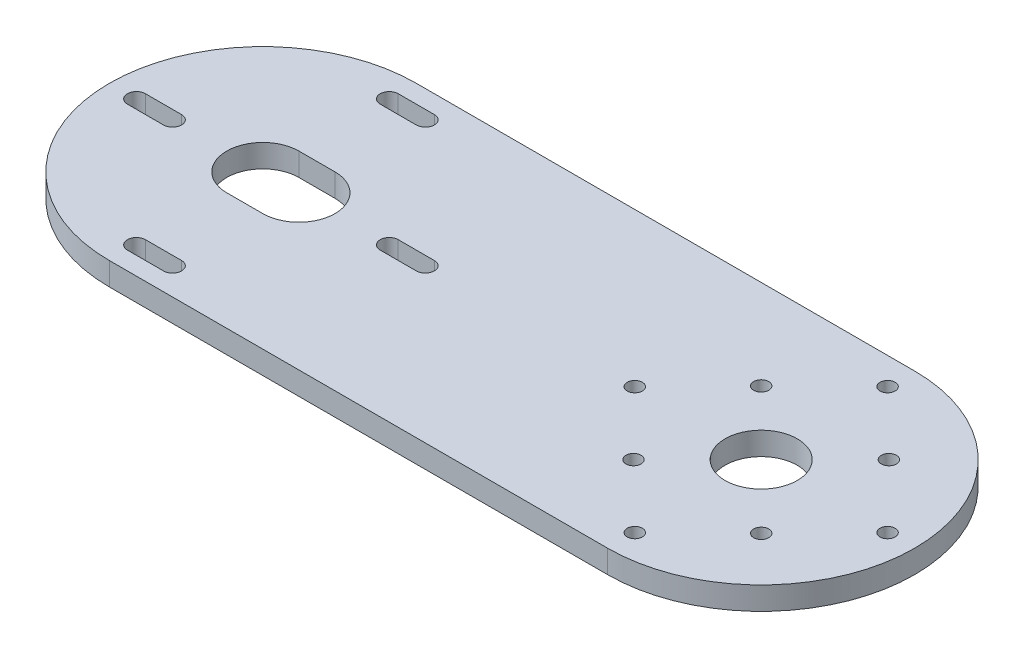
ISO-10303-21;
HEADER;
FILE_DESCRIPTION(('STEP AP214'),'2;1');
FILE_NAME('part.step','',(''),(''),'','','');
FILE_SCHEMA(('AUTOMOTIVE_DESIGN { 1 0 10303 214 1 1 1 1 }'));
ENDSEC;
DATA;
#1=APPLICATION_CONTEXT('core data for automotive mechanical design processes');
#2=APPLICATION_PROTOCOL_DEFINITION('international standard','automotive_design',2000,#1);
#3=PRODUCT_CONTEXT('',#1,'mechanical');
#4=PRODUCT('Part','Part','',(#3));
#5=PRODUCT_RELATED_PRODUCT_CATEGORY('part','',(#4));
#6=PRODUCT_DEFINITION_FORMATION('','',#4);
#7=PRODUCT_DEFINITION_CONTEXT('part definition',#1,'design');
#8=PRODUCT_DEFINITION('design','',#6,#7);
#9=PRODUCT_DEFINITION_SHAPE('','',#8);
#10=(LENGTH_UNIT() NAMED_UNIT(*) SI_UNIT(.MILLI.,.METRE.));
#11=(NAMED_UNIT(*) PLANE_ANGLE_UNIT() SI_UNIT($,.RADIAN.));
#12=(NAMED_UNIT(*) SI_UNIT($,.STERADIAN.) SOLID_ANGLE_UNIT());
#13=UNCERTAINTY_MEASURE_WITH_UNIT(LENGTH_MEASURE(1.E-05),#10,'distance_accuracy_value','');
#14=(GEOMETRIC_REPRESENTATION_CONTEXT(3) GLOBAL_UNCERTAINTY_ASSIGNED_CONTEXT((#13)) GLOBAL_UNIT_ASSIGNED_CONTEXT((#10,
#11,#12)) REPRESENTATION_CONTEXT('',''));
#15=CARTESIAN_POINT('',(0.,0.,0.));
#16=DIRECTION('',(0.,0.,1.));
#17=DIRECTION('',(1.,0.,0.));
#18=AXIS2_PLACEMENT_3D('',#15,#16,#17);
#19=CARTESIAN_POINT('',(-128.,-6.35,-35.));
#20=DIRECTION('',(0.,1.,0.));
#21=DIRECTION('',(0.,0.,1.));
#22=AXIS2_PLACEMENT_3D('',#19,#20,#21);
#23=CYLINDRICAL_SURFACE('',#22,2.5);
#24=CARTESIAN_POINT('',(-128.,0.,-35.));
#25=DIRECTION('',(0.,1.,0.));
#26=DIRECTION('',(0.,0.,1.));
#27=AXIS2_PLACEMENT_3D('',#24,#25,#26);
#28=CIRCLE('',#27,2.5);
#29=CARTESIAN_POINT('',(-128.,0.,-32.5));
#30=VERTEX_POINT('',#29);
#31=CARTESIAN_POINT('',(-128.,0.,-37.5));
#32=VERTEX_POINT('',#31);
#33=EDGE_CURVE('E309',#30,#32,#28,.T.);
#34=ORIENTED_EDGE('',*,*,#33,.T.);
#35=DIRECTION('',(0.,1.,0.));
#36=VECTOR('',#35,1.);
#37=CARTESIAN_POINT('',(-128.,-6.35,-37.5));
#38=LINE('',#37,#36);
#39=CARTESIAN_POINT('',(-128.,-6.35,-37.5));
#40=VERTEX_POINT('',#39);
#41=EDGE_CURVE('E11',#40,#32,#38,.T.);
#42=ORIENTED_EDGE('',*,*,#41,.F.);
#43=CARTESIAN_POINT('',(-128.,-6.35,-35.));
#44=DIRECTION('',(0.,1.,0.));
#45=DIRECTION('',(0.,0.,1.));
#46=AXIS2_PLACEMENT_3D('',#43,#44,#45);
#47=CIRCLE('',#46,2.5);
#48=CARTESIAN_POINT('',(-128.,-6.35,-32.5));
#49=VERTEX_POINT('',#48);
#50=EDGE_CURVE('E54',#49,#40,#47,.T.);
#51=ORIENTED_EDGE('',*,*,#50,.F.);
#52=DIRECTION('',(0.,1.,0.));
#53=VECTOR('',#52,1.);
#54=CARTESIAN_POINT('',(-128.,-6.35,-32.5));
#55=LINE('',#54,#53);
#56=EDGE_CURVE('E219',#49,#30,#55,.T.);
#57=ORIENTED_EDGE('',*,*,#56,.T.);
#58=EDGE_LOOP('',(#34,#42,#51,#57));
#59=FACE_BOUND('',#58,.T.);
#60=ADVANCED_FACE('F35',(#59),#23,.F.);
#61=CARTESIAN_POINT('',(0.,-6.35,-37.4999999999999));
#62=DIRECTION('',(0.,0.,1.));
#63=DIRECTION('',(1.,0.,0.));
#64=AXIS2_PLACEMENT_3D('',#61,#62,#63);
#65=PLANE('',#64);
#66=DIRECTION('',(1.,0.,0.));
#67=VECTOR('',#66,1.);
#68=CARTESIAN_POINT('',(0.,0.,-37.4999999999999));
#69=LINE('',#68,#67);
#70=CARTESIAN_POINT('',(-138.,0.,-37.5));
#71=VERTEX_POINT('',#70);
#72=EDGE_CURVE('E314',#71,#32,#69,.T.);
#73=ORIENTED_EDGE('',*,*,#72,.F.);
#74=DIRECTION('',(0.,1.,0.));
#75=VECTOR('',#74,1.);
#76=CARTESIAN_POINT('',(-138.,-6.35,-37.5));
#77=LINE('',#76,#75);
#78=CARTESIAN_POINT('',(-138.,-6.35,-37.5));
#79=VERTEX_POINT('',#78);
#80=EDGE_CURVE('E45',#79,#71,#77,.T.);
#81=ORIENTED_EDGE('',*,*,#80,.F.);
#82=DIRECTION('',(1.,0.,0.));
#83=VECTOR('',#82,1.);
#84=CARTESIAN_POINT('',(0.,-6.35,-37.4999999999999));
#85=LINE('',#84,#83);
#86=EDGE_CURVE('E211',#79,#40,#85,.T.);
#87=ORIENTED_EDGE('',*,*,#86,.T.);
#88=ORIENTED_EDGE('',*,*,#41,.T.);
#89=EDGE_LOOP('',(#73,#81,#87,#88));
#90=FACE_BOUND('',#89,.T.);
#91=ADVANCED_FACE('F485',(#90),#65,.T.);
#92=CARTESIAN_POINT('',(-138.,-6.35,-35.));
#93=DIRECTION('',(0.,1.,0.));
#94=DIRECTION('',(0.,0.,1.));
#95=AXIS2_PLACEMENT_3D('',#92,#93,#94);
#96=CYLINDRICAL_SURFACE('',#95,2.50000000000001);
#97=CARTESIAN_POINT('',(-138.,0.,-35.));
#98=DIRECTION('',(0.,1.,0.));
#99=DIRECTION('',(0.,0.,1.));
#100=AXIS2_PLACEMENT_3D('',#97,#98,#99);
#101=CIRCLE('',#100,2.50000000000001);
#102=CARTESIAN_POINT('',(-138.,0.,-32.5));
#103=VERTEX_POINT('',#102);
#104=EDGE_CURVE('E216',#71,#103,#101,.T.);
#105=ORIENTED_EDGE('',*,*,#104,.T.);
#106=DIRECTION('',(0.,1.,0.));
#107=VECTOR('',#106,1.);
#108=CARTESIAN_POINT('',(-138.,-6.35,-32.5));
#109=LINE('',#108,#107);
#110=CARTESIAN_POINT('',(-138.,-6.35,-32.5));
#111=VERTEX_POINT('',#110);
#112=EDGE_CURVE('E214',#111,#103,#109,.T.);
#113=ORIENTED_EDGE('',*,*,#112,.F.);
#114=CARTESIAN_POINT('',(-138.,-6.35,-35.));
#115=DIRECTION('',(0.,1.,0.));
#116=DIRECTION('',(0.,0.,1.));
#117=AXIS2_PLACEMENT_3D('',#114,#115,#116);
#118=CIRCLE('',#117,2.50000000000001);
#119=EDGE_CURVE('E204',#79,#111,#118,.T.);
#120=ORIENTED_EDGE('',*,*,#119,.F.);
#121=ORIENTED_EDGE('',*,*,#80,.T.);
#122=EDGE_LOOP('',(#105,#113,#120,#121));
#123=FACE_BOUND('',#122,.T.);
#124=ADVANCED_FACE('F215',(#123),#96,.F.);
#125=CARTESIAN_POINT('',(-163.,-6.35,0.));
#126=DIRECTION('',(0.,1.,0.));
#127=DIRECTION('',(0.,0.,1.));
#128=AXIS2_PLACEMENT_3D('',#125,#126,#127);
#129=CYLINDRICAL_SURFACE('',#128,2.5);
#130=CARTESIAN_POINT('',(-163.,0.,0.));
#131=DIRECTION('',(0.,1.,0.));
#132=DIRECTION('',(0.,0.,1.));
#133=AXIS2_PLACEMENT_3D('',#130,#131,#132);
#134=CIRCLE('',#133,2.5);
#135=CARTESIAN_POINT('',(-163.,0.,2.5));
#136=VERTEX_POINT('',#135);
#137=CARTESIAN_POINT('',(-163.,0.,-2.5));
#138=VERTEX_POINT('',#137);
#139=EDGE_CURVE('E299',#136,#138,#134,.T.);
#140=ORIENTED_EDGE('',*,*,#139,.T.);
#141=DIRECTION('',(0.,1.,0.));
#142=VECTOR('',#141,1.);
#143=CARTESIAN_POINT('',(-163.,-6.35,-2.5));
#144=LINE('',#143,#142);
#145=CARTESIAN_POINT('',(-163.,-6.35,-2.5));
#146=VERTEX_POINT('',#145);
#147=EDGE_CURVE('E347',#146,#138,#144,.T.);
#148=ORIENTED_EDGE('',*,*,#147,.F.);
#149=CARTESIAN_POINT('',(-163.,-6.35,0.));
#150=DIRECTION('',(0.,1.,0.));
#151=DIRECTION('',(0.,0.,1.));
#152=AXIS2_PLACEMENT_3D('',#149,#150,#151);
#153=CIRCLE('',#152,2.5);
#154=CARTESIAN_POINT('',(-163.,-6.35,2.5));
#155=VERTEX_POINT('',#154);
#156=EDGE_CURVE('E442',#155,#146,#153,.T.);
#157=ORIENTED_EDGE('',*,*,#156,.F.);
#158=DIRECTION('',(0.,1.,0.));
#159=VECTOR('',#158,1.);
#160=CARTESIAN_POINT('',(-163.,-6.35,2.5));
#161=LINE('',#160,#159);
#162=EDGE_CURVE('E354',#155,#136,#161,.T.);
#163=ORIENTED_EDGE('',*,*,#162,.T.);
#164=EDGE_LOOP('',(#140,#148,#157,#163));
#165=FACE_BOUND('',#164,.T.);
#166=ADVANCED_FACE('F460',(#165),#129,.F.);
#167=CARTESIAN_POINT('',(0.,-6.35,-2.5));
#168=DIRECTION('',(0.,0.,1.));
#169=DIRECTION('',(1.,0.,0.));
#170=AXIS2_PLACEMENT_3D('',#167,#168,#169);
#171=PLANE('',#170);
#172=DIRECTION('',(1.,0.,0.));
#173=VECTOR('',#172,1.);
#174=CARTESIAN_POINT('',(0.,0.,-2.5));
#175=LINE('',#174,#173);
#176=CARTESIAN_POINT('',(-173.,0.,-2.5));
#177=VERTEX_POINT('',#176);
#178=EDGE_CURVE('E306',#177,#138,#175,.T.);
#179=ORIENTED_EDGE('',*,*,#178,.F.);
#180=DIRECTION('',(0.,1.,0.));
#181=VECTOR('',#180,1.);
#182=CARTESIAN_POINT('',(-173.,-6.35,-2.5));
#183=LINE('',#182,#181);
#184=CARTESIAN_POINT('',(-173.,-6.35,-2.5));
#185=VERTEX_POINT('',#184);
#186=EDGE_CURVE('E349',#185,#177,#183,.T.);
#187=ORIENTED_EDGE('',*,*,#186,.F.);
#188=DIRECTION('',(1.,0.,0.));
#189=VECTOR('',#188,1.);
#190=CARTESIAN_POINT('',(0.,-6.35,-2.5));
#191=LINE('',#190,#189);
#192=EDGE_CURVE('E224',#185,#146,#191,.T.);
#193=ORIENTED_EDGE('',*,*,#192,.T.);
#194=ORIENTED_EDGE('',*,*,#147,.T.);
#195=EDGE_LOOP('',(#179,#187,#193,#194));
#196=FACE_BOUND('',#195,.T.);
#197=ADVANCED_FACE('F451',(#196),#171,.T.);
#198=CARTESIAN_POINT('',(-173.,-6.35,0.));
#199=DIRECTION('',(0.,1.,0.));
#200=DIRECTION('',(0.,0.,1.));
#201=AXIS2_PLACEMENT_3D('',#198,#199,#200);
#202=CYLINDRICAL_SURFACE('',#201,2.5);
#203=CARTESIAN_POINT('',(-173.,0.,0.));
#204=DIRECTION('',(0.,1.,0.));
#205=DIRECTION('',(0.,0.,1.));
#206=AXIS2_PLACEMENT_3D('',#203,#204,#205);
#207=CIRCLE('',#206,2.5);
#208=CARTESIAN_POINT('',(-173.,0.,2.5));
#209=VERTEX_POINT('',#208);
#210=EDGE_CURVE('E304',#177,#209,#207,.T.);
#211=ORIENTED_EDGE('',*,*,#210,.T.);
#212=DIRECTION('',(0.,1.,0.));
#213=VECTOR('',#212,1.);
#214=CARTESIAN_POINT('',(-173.,-6.35,2.5));
#215=LINE('',#214,#213);
#216=CARTESIAN_POINT('',(-173.,-6.35,2.5));
#217=VERTEX_POINT('',#216);
#218=EDGE_CURVE('E351',#217,#209,#215,.T.);
#219=ORIENTED_EDGE('',*,*,#218,.F.);
#220=CARTESIAN_POINT('',(-173.,-6.35,0.));
#221=DIRECTION('',(0.,1.,0.));
#222=DIRECTION('',(0.,0.,1.));
#223=AXIS2_PLACEMENT_3D('',#220,#221,#222);
#224=CIRCLE('',#223,2.5);
#225=EDGE_CURVE('E446',#185,#217,#224,.T.);
#226=ORIENTED_EDGE('',*,*,#225,.F.);
#227=ORIENTED_EDGE('',*,*,#186,.T.);
#228=EDGE_LOOP('',(#211,#219,#226,#227));
#229=FACE_BOUND('',#228,.T.);
#230=ADVANCED_FACE('F467',(#229),#202,.F.);
#231=CARTESIAN_POINT('',(-128.,-6.35,35.));
#232=DIRECTION('',(0.,1.,0.));
#233=DIRECTION('',(0.,0.,1.));
#234=AXIS2_PLACEMENT_3D('',#231,#232,#233);
#235=CYLINDRICAL_SURFACE('',#234,2.5);
#236=CARTESIAN_POINT('',(-128.,0.,35.));
#237=DIRECTION('',(0.,1.,0.));
#238=DIRECTION('',(0.,0.,1.));
#239=AXIS2_PLACEMENT_3D('',#236,#237,#238);
#240=CIRCLE('',#239,2.5);
#241=CARTESIAN_POINT('',(-128.,0.,37.5));
#242=VERTEX_POINT('',#241);
#243=CARTESIAN_POINT('',(-128.,0.,32.5));
#244=VERTEX_POINT('',#243);
#245=EDGE_CURVE('E289',#242,#244,#240,.T.);
#246=ORIENTED_EDGE('',*,*,#245,.T.);
#247=DIRECTION('',(0.,1.,0.));
#248=VECTOR('',#247,1.);
#249=CARTESIAN_POINT('',(-128.,-6.35,32.5));
#250=LINE('',#249,#248);
#251=CARTESIAN_POINT('',(-128.,-6.35,32.5));
#252=VERTEX_POINT('',#251);
#253=EDGE_CURVE('E357',#252,#244,#250,.T.);
#254=ORIENTED_EDGE('',*,*,#253,.F.);
#255=CARTESIAN_POINT('',(-128.,-6.35,35.));
#256=DIRECTION('',(0.,1.,0.));
#257=DIRECTION('',(0.,0.,1.));
#258=AXIS2_PLACEMENT_3D('',#255,#256,#257);
#259=CIRCLE('',#258,2.5);
#260=CARTESIAN_POINT('',(-128.,-6.35,37.5));
#261=VERTEX_POINT('',#260);
#262=EDGE_CURVE('E433',#261,#252,#259,.T.);
#263=ORIENTED_EDGE('',*,*,#262,.F.);
#264=DIRECTION('',(0.,1.,0.));
#265=VECTOR('',#264,1.);
#266=CARTESIAN_POINT('',(-128.,-6.35,37.5));
#267=LINE('',#266,#265);
#268=EDGE_CURVE('E364',#261,#242,#267,.T.);
#269=ORIENTED_EDGE('',*,*,#268,.T.);
#270=EDGE_LOOP('',(#246,#254,#263,#269));
#271=FACE_BOUND('',#270,.T.);
#272=ADVANCED_FACE('F496',(#271),#235,.F.);
#273=CARTESIAN_POINT('',(0.,-6.35,32.5000000000001));
#274=DIRECTION('',(0.,0.,1.));
#275=DIRECTION('',(1.,0.,0.));
#276=AXIS2_PLACEMENT_3D('',#273,#274,#275);
#277=PLANE('',#276);
#278=DIRECTION('',(1.,0.,0.));
#279=VECTOR('',#278,1.);
#280=CARTESIAN_POINT('',(0.,0.,32.5000000000001));
#281=LINE('',#280,#279);
#282=CARTESIAN_POINT('',(-138.,0.,32.5));
#283=VERTEX_POINT('',#282);
#284=EDGE_CURVE('E296',#283,#244,#281,.T.);
#285=ORIENTED_EDGE('',*,*,#284,.F.);
#286=DIRECTION('',(0.,1.,0.));
#287=VECTOR('',#286,1.);
#288=CARTESIAN_POINT('',(-138.,-6.35,32.5));
#289=LINE('',#288,#287);
#290=CARTESIAN_POINT('',(-138.,-6.35,32.5));
#291=VERTEX_POINT('',#290);
#292=EDGE_CURVE('E359',#291,#283,#289,.T.);
#293=ORIENTED_EDGE('',*,*,#292,.F.);
#294=DIRECTION('',(1.,0.,0.));
#295=VECTOR('',#294,1.);
#296=CARTESIAN_POINT('',(0.,-6.35,32.5000000000001));
#297=LINE('',#296,#295);
#298=EDGE_CURVE('E439',#291,#252,#297,.T.);
#299=ORIENTED_EDGE('',*,*,#298,.T.);
#300=ORIENTED_EDGE('',*,*,#253,.T.);
#301=EDGE_LOOP('',(#285,#293,#299,#300));
#302=FACE_BOUND('',#301,.T.);
#303=ADVANCED_FACE('F500',(#302),#277,.T.);
#304=CARTESIAN_POINT('',(-138.,-6.35,35.));
#305=DIRECTION('',(0.,1.,0.));
#306=DIRECTION('',(0.,0.,1.));
#307=AXIS2_PLACEMENT_3D('',#304,#305,#306);
#308=CYLINDRICAL_SURFACE('',#307,2.50000000000001);
#309=CARTESIAN_POINT('',(-138.,0.,35.));
#310=DIRECTION('',(0.,1.,0.));
#311=DIRECTION('',(0.,0.,1.));
#312=AXIS2_PLACEMENT_3D('',#309,#310,#311);
#313=CIRCLE('',#312,2.50000000000001);
#314=CARTESIAN_POINT('',(-138.,0.,37.5));
#315=VERTEX_POINT('',#314);
#316=EDGE_CURVE('E294',#283,#315,#313,.T.);
#317=ORIENTED_EDGE('',*,*,#316,.T.);
#318=DIRECTION('',(0.,1.,0.));
#319=VECTOR('',#318,1.);
#320=CARTESIAN_POINT('',(-138.,-6.35,37.5));
#321=LINE('',#320,#319);
#322=CARTESIAN_POINT('',(-138.,-6.35,37.5));
#323=VERTEX_POINT('',#322);
#324=EDGE_CURVE('E361',#323,#315,#321,.T.);
#325=ORIENTED_EDGE('',*,*,#324,.F.);
#326=CARTESIAN_POINT('',(-138.,-6.35,35.));
#327=DIRECTION('',(0.,1.,0.));
#328=DIRECTION('',(0.,0.,1.));
#329=AXIS2_PLACEMENT_3D('',#326,#327,#328);
#330=CIRCLE('',#329,2.50000000000001);
#331=EDGE_CURVE('E437',#291,#323,#330,.T.);
#332=ORIENTED_EDGE('',*,*,#331,.F.);
#333=ORIENTED_EDGE('',*,*,#292,.T.);
#334=EDGE_LOOP('',(#317,#325,#332,#333));
#335=FACE_BOUND('',#334,.T.);
#336=ADVANCED_FACE('F506',(#335),#308,.F.);
#337=CARTESIAN_POINT('',(-128.,-6.35,0.));
#338=DIRECTION('',(0.,1.,0.));
#339=DIRECTION('',(0.,0.,1.));
#340=AXIS2_PLACEMENT_3D('',#337,#338,#339);
#341=CYLINDRICAL_SURFACE('',#340,10.);
#342=CARTESIAN_POINT('',(-128.,0.,0.));
#343=DIRECTION('',(0.,1.,0.));
#344=DIRECTION('',(0.,0.,1.));
#345=AXIS2_PLACEMENT_3D('',#342,#343,#344);
#346=CIRCLE('',#345,10.);
#347=CARTESIAN_POINT('',(-128.,0.,10.));
#348=VERTEX_POINT('',#347);
#349=CARTESIAN_POINT('',(-128.,0.,-10.));
#350=VERTEX_POINT('',#349);
#351=EDGE_CURVE('E279',#348,#350,#346,.T.);
#352=ORIENTED_EDGE('',*,*,#351,.T.);
#353=DIRECTION('',(0.,1.,0.));
#354=VECTOR('',#353,1.);
#355=CARTESIAN_POINT('',(-128.,-6.35,-10.));
#356=LINE('',#355,#354);
#357=CARTESIAN_POINT('',(-128.,-6.35,-10.));
#358=VERTEX_POINT('',#357);
#359=EDGE_CURVE('E367',#358,#350,#356,.T.);
#360=ORIENTED_EDGE('',*,*,#359,.F.);
#361=CARTESIAN_POINT('',(-128.,-6.35,0.));
#362=DIRECTION('',(0.,1.,0.));
#363=DIRECTION('',(0.,0.,1.));
#364=AXIS2_PLACEMENT_3D('',#361,#362,#363);
#365=CIRCLE('',#364,10.);
#366=CARTESIAN_POINT('',(-128.,-6.35,10.));
#367=VERTEX_POINT('',#366);
#368=EDGE_CURVE('E424',#367,#358,#365,.T.);
#369=ORIENTED_EDGE('',*,*,#368,.F.);
#370=DIRECTION('',(0.,1.,0.));
#371=VECTOR('',#370,1.);
#372=CARTESIAN_POINT('',(-128.,-6.35,10.));
#373=LINE('',#372,#371);
#374=EDGE_CURVE('E374',#367,#348,#373,.T.);
#375=ORIENTED_EDGE('',*,*,#374,.T.);
#376=EDGE_LOOP('',(#352,#360,#369,#375));
#377=FACE_BOUND('',#376,.T.);
#378=ADVANCED_FACE('F515',(#377),#341,.F.);
#379=CARTESIAN_POINT('',(0.,-6.35,-10.));
#380=DIRECTION('',(0.,0.,1.));
#381=DIRECTION('',(1.,0.,0.));
#382=AXIS2_PLACEMENT_3D('',#379,#380,#381);
#383=PLANE('',#382);
#384=DIRECTION('',(1.,0.,0.));
#385=VECTOR('',#384,1.);
#386=CARTESIAN_POINT('',(0.,0.,-10.));
#387=LINE('',#386,#385);
#388=CARTESIAN_POINT('',(-138.,0.,-10.));
#389=VERTEX_POINT('',#388);
#390=EDGE_CURVE('E286',#389,#350,#387,.T.);
#391=ORIENTED_EDGE('',*,*,#390,.F.);
#392=DIRECTION('',(0.,1.,0.));
#393=VECTOR('',#392,1.);
#394=CARTESIAN_POINT('',(-138.,-6.35,-10.));
#395=LINE('',#394,#393);
#396=CARTESIAN_POINT('',(-138.,-6.35,-10.));
#397=VERTEX_POINT('',#396);
#398=EDGE_CURVE('E369',#397,#389,#395,.T.);
#399=ORIENTED_EDGE('',*,*,#398,.F.);
#400=DIRECTION('',(1.,0.,0.));
#401=VECTOR('',#400,1.);
#402=CARTESIAN_POINT('',(0.,-6.35,-10.));
#403=LINE('',#402,#401);
#404=EDGE_CURVE('E430',#397,#358,#403,.T.);
#405=ORIENTED_EDGE('',*,*,#404,.T.);
#406=ORIENTED_EDGE('',*,*,#359,.T.);
#407=EDGE_LOOP('',(#391,#399,#405,#406));
#408=FACE_BOUND('',#407,.T.);
#409=ADVANCED_FACE('F511',(#408),#383,.T.);
#410=CARTESIAN_POINT('',(-138.,-6.35,0.));
#411=DIRECTION('',(0.,1.,0.));
#412=DIRECTION('',(0.,0.,1.));
#413=AXIS2_PLACEMENT_3D('',#410,#411,#412);
#414=CYLINDRICAL_SURFACE('',#413,10.);
#415=CARTESIAN_POINT('',(-138.,0.,0.));
#416=DIRECTION('',(0.,1.,0.));
#417=DIRECTION('',(0.,0.,1.));
#418=AXIS2_PLACEMENT_3D('',#415,#416,#417);
#419=CIRCLE('',#418,10.);
#420=CARTESIAN_POINT('',(-138.,0.,10.));
#421=VERTEX_POINT('',#420);
#422=EDGE_CURVE('E284',#389,#421,#419,.T.);
#423=ORIENTED_EDGE('',*,*,#422,.T.);
#424=DIRECTION('',(0.,1.,0.));
#425=VECTOR('',#424,1.);
#426=CARTESIAN_POINT('',(-138.,-6.35,10.));
#427=LINE('',#426,#425);
#428=CARTESIAN_POINT('',(-138.,-6.35,10.));
#429=VERTEX_POINT('',#428);
#430=EDGE_CURVE('E371',#429,#421,#427,.T.);
#431=ORIENTED_EDGE('',*,*,#430,.F.);
#432=CARTESIAN_POINT('',(-138.,-6.35,0.));
#433=DIRECTION('',(0.,1.,0.));
#434=DIRECTION('',(0.,0.,1.));
#435=AXIS2_PLACEMENT_3D('',#432,#433,#434);
#436=CIRCLE('',#435,10.);
#437=EDGE_CURVE('E428',#397,#429,#436,.T.);
#438=ORIENTED_EDGE('',*,*,#437,.F.);
#439=ORIENTED_EDGE('',*,*,#398,.T.);
#440=EDGE_LOOP('',(#423,#431,#438,#439));
#441=FACE_BOUND('',#440,.T.);
#442=ADVANCED_FACE('F514',(#441),#414,.F.);
#443=CARTESIAN_POINT('',(-138.,-6.35,0.));
#444=DIRECTION('',(0.,1.,0.));
#445=DIRECTION('',(0.,0.,1.));
#446=AXIS2_PLACEMENT_3D('',#443,#444,#445);
#447=CYLINDRICAL_SURFACE('',#446,42.5);
#448=CARTESIAN_POINT('',(-138.,0.,0.));
#449=DIRECTION('',(0.,1.,0.));
#450=DIRECTION('',(0.,0.,1.));
#451=AXIS2_PLACEMENT_3D('',#448,#449,#450);
#452=CIRCLE('',#451,42.5);
#453=CARTESIAN_POINT('',(-138.,0.,-42.5));
#454=VERTEX_POINT('',#453);
#455=CARTESIAN_POINT('',(-138.,0.,42.5));
#456=VERTEX_POINT('',#455);
#457=EDGE_CURVE('E267',#454,#456,#452,.T.);
#458=ORIENTED_EDGE('',*,*,#457,.F.);
#459=DIRECTION('',(0.,1.,0.));
#460=VECTOR('',#459,1.);
#461=CARTESIAN_POINT('',(-138.,-6.35,-42.5));
#462=LINE('',#461,#460);
#463=CARTESIAN_POINT('',(-138.,-6.35,-42.5));
#464=VERTEX_POINT('',#463);
#465=EDGE_CURVE('E377',#464,#454,#462,.T.);
#466=ORIENTED_EDGE('',*,*,#465,.F.);
#467=CARTESIAN_POINT('',(-138.,-6.35,0.));
#468=DIRECTION('',(0.,1.,0.));
#469=DIRECTION('',(0.,0.,1.));
#470=AXIS2_PLACEMENT_3D('',#467,#468,#469);
#471=CIRCLE('',#470,42.5);
#472=CARTESIAN_POINT('',(-138.,-6.35,42.5));
#473=VERTEX_POINT('',#472);
#474=EDGE_CURVE('E406',#464,#473,#471,.T.);
#475=ORIENTED_EDGE('',*,*,#474,.T.);
#476=DIRECTION('',(0.,1.,0.));
#477=VECTOR('',#476,1.);
#478=CARTESIAN_POINT('',(-138.,-6.35,42.5));
#479=LINE('',#478,#477);
#480=EDGE_CURVE('E383',#473,#456,#479,.T.);
#481=ORIENTED_EDGE('',*,*,#480,.T.);
#482=EDGE_LOOP('',(#458,#466,#475,#481));
#483=FACE_BOUND('',#482,.T.);
#484=ADVANCED_FACE('F519',(#483),#447,.T.);
#485=CARTESIAN_POINT('',(0.,-6.35,-42.5));
#486=DIRECTION('',(0.,0.,1.));
#487=DIRECTION('',(1.,0.,0.));
#488=AXIS2_PLACEMENT_3D('',#485,#486,#487);
#489=PLANE('',#488);
#490=DIRECTION('',(1.,0.,0.));
#491=VECTOR('',#490,1.);
#492=CARTESIAN_POINT('',(0.,0.,-42.5));
#493=LINE('',#492,#491);
#494=CARTESIAN_POINT('',(0.,0.,-42.5));
#495=VERTEX_POINT('',#494);
#496=EDGE_CURVE('E276',#454,#495,#493,.T.);
#497=ORIENTED_EDGE('',*,*,#496,.T.);
#498=DIRECTION('',(0.,1.,0.));
#499=VECTOR('',#498,1.);
#500=CARTESIAN_POINT('',(0.,-6.35,-42.5));
#501=LINE('',#500,#499);
#502=CARTESIAN_POINT('',(0.,-6.35,-42.5));
#503=VERTEX_POINT('',#502);
#504=EDGE_CURVE('E379',#503,#495,#501,.T.);
#505=ORIENTED_EDGE('',*,*,#504,.F.);
#506=DIRECTION('',(1.,0.,0.));
#507=VECTOR('',#506,1.);
#508=CARTESIAN_POINT('',(0.,-6.35,-42.5));
#509=LINE('',#508,#507);
#510=EDGE_CURVE('E422',#464,#503,#509,.T.);
#511=ORIENTED_EDGE('',*,*,#510,.F.);
#512=ORIENTED_EDGE('',*,*,#465,.T.);
#513=EDGE_LOOP('',(#497,#505,#511,#512));
#514=FACE_BOUND('',#513,.T.);
#515=ADVANCED_FACE('F528',(#514),#489,.F.);
#516=CARTESIAN_POINT('',(0.,-6.35,0.));
#517=DIRECTION('',(0.,1.,0.));
#518=DIRECTION('',(0.,0.,1.));
#519=AXIS2_PLACEMENT_3D('',#516,#517,#518);
#520=CYLINDRICAL_SURFACE('',#519,42.5);
#521=CARTESIAN_POINT('',(0.,0.,0.));
#522=DIRECTION('',(0.,1.,0.));
#523=DIRECTION('',(0.,0.,1.));
#524=AXIS2_PLACEMENT_3D('',#521,#522,#523);
#525=CIRCLE('',#524,42.5);
#526=CARTESIAN_POINT('',(0.,0.,42.5));
#527=VERTEX_POINT('',#526);
#528=EDGE_CURVE('E273',#527,#495,#525,.T.);
#529=ORIENTED_EDGE('',*,*,#528,.F.);
#530=DIRECTION('',(0.,1.,0.));
#531=VECTOR('',#530,1.);
#532=CARTESIAN_POINT('',(0.,-6.35,42.5));
#533=LINE('',#532,#531);
#534=CARTESIAN_POINT('',(0.,-6.35,42.5));
#535=VERTEX_POINT('',#534);
#536=EDGE_CURVE('E381',#535,#527,#533,.T.);
#537=ORIENTED_EDGE('',*,*,#536,.F.);
#538=CARTESIAN_POINT('',(0.,-6.35,0.));
#539=DIRECTION('',(0.,1.,0.));
#540=DIRECTION('',(0.,0.,1.));
#541=AXIS2_PLACEMENT_3D('',#538,#539,#540);
#542=CIRCLE('',#541,42.5);
#543=EDGE_CURVE('E419',#535,#503,#542,.T.);
#544=ORIENTED_EDGE('',*,*,#543,.T.);
#545=ORIENTED_EDGE('',*,*,#504,.T.);
#546=EDGE_LOOP('',(#529,#537,#544,#545));
#547=FACE_BOUND('',#546,.T.);
#548=ADVANCED_FACE('F531',(#547),#520,.T.);
#549=CARTESIAN_POINT('',(0.,-6.35,2.5));
#550=DIRECTION('',(0.,0.,1.));
#551=DIRECTION('',(1.,0.,0.));
#552=AXIS2_PLACEMENT_3D('',#549,#550,#551);
#553=PLANE('',#552);
#554=DIRECTION('',(1.,0.,0.));
#555=VECTOR('',#554,1.);
#556=CARTESIAN_POINT('',(0.,0.,2.5));
#557=LINE('',#556,#555);
#558=CARTESIAN_POINT('',(-103.,0.,2.5));
#559=VERTEX_POINT('',#558);
#560=CARTESIAN_POINT('',(-93.,0.,2.5));
#561=VERTEX_POINT('',#560);
#562=EDGE_CURVE('E256',#559,#561,#557,.T.);
#563=ORIENTED_EDGE('',*,*,#562,.T.);
#564=DIRECTION('',(0.,1.,0.));
#565=VECTOR('',#564,1.);
#566=CARTESIAN_POINT('',(-93.,-6.35,2.5));
#567=LINE('',#566,#565);
#568=CARTESIAN_POINT('',(-93.,-6.35,2.5));
#569=VERTEX_POINT('',#568);
#570=EDGE_CURVE('E385',#569,#561,#567,.T.);
#571=ORIENTED_EDGE('',*,*,#570,.F.);
#572=DIRECTION('',(1.,0.,0.));
#573=VECTOR('',#572,1.);
#574=CARTESIAN_POINT('',(0.,-6.35,2.5));
#575=LINE('',#574,#573);
#576=CARTESIAN_POINT('',(-103.,-6.35,2.5));
#577=VERTEX_POINT('',#576);
#578=EDGE_CURVE('E343',#577,#569,#575,.T.);
#579=ORIENTED_EDGE('',*,*,#578,.F.);
#580=DIRECTION('',(0.,1.,0.));
#581=VECTOR('',#580,1.);
#582=CARTESIAN_POINT('',(-103.,-6.35,2.5));
#583=LINE('',#582,#581);
#584=EDGE_CURVE('E39',#577,#559,#583,.T.);
#585=ORIENTED_EDGE('',*,*,#584,.T.);
#586=EDGE_LOOP('',(#563,#571,#579,#585));
#587=FACE_BOUND('',#586,.T.);
#588=ADVANCED_FACE('F37',(#587),#553,.F.);
#589=CARTESIAN_POINT('',(-93.,-6.35,0.));
#590=DIRECTION('',(0.,1.,0.));
#591=DIRECTION('',(0.,0.,1.));
#592=AXIS2_PLACEMENT_3D('',#589,#590,#591);
#593=CYLINDRICAL_SURFACE('',#592,2.5);
#594=CARTESIAN_POINT('',(-93.,0.,0.));
#595=DIRECTION('',(0.,1.,0.));
#596=DIRECTION('',(0.,0.,1.));
#597=AXIS2_PLACEMENT_3D('',#594,#595,#596);
#598=CIRCLE('',#597,2.5);
#599=CARTESIAN_POINT('',(-93.,0.,-2.5));
#600=VERTEX_POINT('',#599);
#601=EDGE_CURVE('E264',#561,#600,#598,.T.);
#602=ORIENTED_EDGE('',*,*,#601,.T.);
#603=DIRECTION('',(0.,1.,0.));
#604=VECTOR('',#603,1.);
#605=CARTESIAN_POINT('',(-93.,-6.35,-2.5));
#606=LINE('',#605,#604);
#607=CARTESIAN_POINT('',(-93.,-6.35,-2.5));
#608=VERTEX_POINT('',#607);
#609=EDGE_CURVE('E388',#608,#600,#606,.T.);
#610=ORIENTED_EDGE('',*,*,#609,.F.);
#611=CARTESIAN_POINT('',(-93.,-6.35,0.));
#612=DIRECTION('',(0.,1.,0.));
#613=DIRECTION('',(0.,0.,1.));
#614=AXIS2_PLACEMENT_3D('',#611,#612,#613);
#615=CIRCLE('',#614,2.5);
#616=EDGE_CURVE('E404',#569,#608,#615,.T.);
#617=ORIENTED_EDGE('',*,*,#616,.F.);
#618=ORIENTED_EDGE('',*,*,#570,.T.);
#619=EDGE_LOOP('',(#602,#610,#617,#618));
#620=FACE_BOUND('',#619,.T.);
#621=ADVANCED_FACE('F403',(#620),#593,.F.);
#622=CARTESIAN_POINT('',(0.,-6.35,-2.5));
#623=DIRECTION('',(0.,0.,1.));
#624=DIRECTION('',(1.,0.,0.));
#625=AXIS2_PLACEMENT_3D('',#622,#623,#624);
#626=PLANE('',#625);
#627=DIRECTION('',(1.,0.,0.));
#628=VECTOR('',#627,1.);
#629=CARTESIAN_POINT('',(0.,0.,-2.5));
#630=LINE('',#629,#628);
#631=CARTESIAN_POINT('',(-103.,0.,-2.5));
#632=VERTEX_POINT('',#631);
#633=EDGE_CURVE('E261',#632,#600,#630,.T.);
#634=ORIENTED_EDGE('',*,*,#633,.F.);
#635=DIRECTION('',(0.,1.,0.));
#636=VECTOR('',#635,1.);
#637=CARTESIAN_POINT('',(-103.,-6.35,-2.5));
#638=LINE('',#637,#636);
#639=CARTESIAN_POINT('',(-103.,-6.35,-2.5));
#640=VERTEX_POINT('',#639);
#641=EDGE_CURVE('E389',#640,#632,#638,.T.);
#642=ORIENTED_EDGE('',*,*,#641,.F.);
#643=DIRECTION('',(1.,0.,0.));
#644=VECTOR('',#643,1.);
#645=CARTESIAN_POINT('',(0.,-6.35,-2.5));
#646=LINE('',#645,#644);
#647=EDGE_CURVE('E407',#640,#608,#646,.T.);
#648=ORIENTED_EDGE('',*,*,#647,.T.);
#649=ORIENTED_EDGE('',*,*,#609,.T.);
#650=EDGE_LOOP('',(#634,#642,#648,#649));
#651=FACE_BOUND('',#650,.T.);
#652=ADVANCED_FACE('F545',(#651),#626,.T.);
#653=CARTESIAN_POINT('',(0.,-6.35,-35.));
#654=DIRECTION('',(0.,1.,0.));
#655=DIRECTION('',(0.,0.,1.));
#656=AXIS2_PLACEMENT_3D('',#653,#654,#655);
#657=CYLINDRICAL_SURFACE('',#656,2.1);
#658=CARTESIAN_POINT('',(0.,-6.35,-35.));
#659=DIRECTION('',(0.,1.,0.));
#660=DIRECTION('',(0.,0.,1.));
#661=AXIS2_PLACEMENT_3D('',#658,#659,#660);
#662=CIRCLE('',#661,2.1);
#663=CARTESIAN_POINT('',(0.,-6.35,-32.9));
#664=VERTEX_POINT('',#663);
#665=EDGE_CURVE('E250',#664,#664,#662,.T.);
#666=ORIENTED_EDGE('',*,*,#665,.F.);
#667=EDGE_LOOP('',(#666));
#668=FACE_BOUND('',#667,.T.);
#669=CARTESIAN_POINT('',(0.,0.,-35.));
#670=DIRECTION('',(0.,1.,0.));
#671=DIRECTION('',(0.,0.,1.));
#672=AXIS2_PLACEMENT_3D('',#669,#670,#671);
#673=CIRCLE('',#672,2.1);
#674=CARTESIAN_POINT('',(0.,0.,-32.9));
#675=VERTEX_POINT('',#674);
#676=EDGE_CURVE('E338',#675,#675,#673,.T.);
#677=ORIENTED_EDGE('',*,*,#676,.T.);
#678=EDGE_LOOP('',(#677));
#679=FACE_BOUND('',#678,.T.);
#680=ADVANCED_FACE('F547',(#668,#679),#657,.F.);
#681=CARTESIAN_POINT('',(35.,-6.35,0.));
#682=DIRECTION('',(0.,1.,0.));
#683=DIRECTION('',(0.,0.,1.));
#684=AXIS2_PLACEMENT_3D('',#681,#682,#683);
#685=CYLINDRICAL_SURFACE('',#684,2.1);
#686=CARTESIAN_POINT('',(35.,-6.35,0.));
#687=DIRECTION('',(0.,1.,0.));
#688=DIRECTION('',(0.,0.,1.));
#689=AXIS2_PLACEMENT_3D('',#686,#687,#688);
#690=CIRCLE('',#689,2.1);
#691=CARTESIAN_POINT('',(35.,-6.35,2.1));
#692=VERTEX_POINT('',#691);
#693=EDGE_CURVE('E247',#692,#692,#690,.T.);
#694=ORIENTED_EDGE('',*,*,#693,.F.);
#695=EDGE_LOOP('',(#694));
#696=FACE_BOUND('',#695,.T.);
#697=CARTESIAN_POINT('',(35.,0.,0.));
#698=DIRECTION('',(0.,1.,0.));
#699=DIRECTION('',(0.,0.,1.));
#700=AXIS2_PLACEMENT_3D('',#697,#698,#699);
#701=CIRCLE('',#700,2.1);
#702=CARTESIAN_POINT('',(35.,0.,2.1));
#703=VERTEX_POINT('',#702);
#704=EDGE_CURVE('E335',#703,#703,#701,.T.);
#705=ORIENTED_EDGE('',*,*,#704,.T.);
#706=EDGE_LOOP('',(#705));
#707=FACE_BOUND('',#706,.T.);
#708=ADVANCED_FACE('F566',(#696,#707),#685,.F.);
#709=CARTESIAN_POINT('',(0.,-6.35,35.));
#710=DIRECTION('',(0.,1.,0.));
#711=DIRECTION('',(0.,0.,1.));
#712=AXIS2_PLACEMENT_3D('',#709,#710,#711);
#713=CYLINDRICAL_SURFACE('',#712,2.1);
#714=CARTESIAN_POINT('',(0.,-6.35,35.));
#715=DIRECTION('',(0.,1.,0.));
#716=DIRECTION('',(0.,0.,1.));
#717=AXIS2_PLACEMENT_3D('',#714,#715,#716);
#718=CIRCLE('',#717,2.1);
#719=CARTESIAN_POINT('',(0.,-6.35,37.1));
#720=VERTEX_POINT('',#719);
#721=EDGE_CURVE('E244',#720,#720,#718,.T.);
#722=ORIENTED_EDGE('',*,*,#721,.F.);
#723=EDGE_LOOP('',(#722));
#724=FACE_BOUND('',#723,.T.);
#725=CARTESIAN_POINT('',(0.,0.,35.));
#726=DIRECTION('',(0.,1.,0.));
#727=DIRECTION('',(0.,0.,1.));
#728=AXIS2_PLACEMENT_3D('',#725,#726,#727);
#729=CIRCLE('',#728,2.1);
#730=CARTESIAN_POINT('',(0.,0.,37.1));
#731=VERTEX_POINT('',#730);
#732=EDGE_CURVE('E332',#731,#731,#729,.T.);
#733=ORIENTED_EDGE('',*,*,#732,.T.);
#734=EDGE_LOOP('',(#733));
#735=FACE_BOUND('',#734,.T.);
#736=ADVANCED_FACE('F570',(#724,#735),#713,.F.);
#737=CARTESIAN_POINT('',(-35.,-6.35,0.));
#738=DIRECTION('',(0.,1.,0.));
#739=DIRECTION('',(0.,0.,1.));
#740=AXIS2_PLACEMENT_3D('',#737,#738,#739);
#741=CYLINDRICAL_SURFACE('',#740,2.1);
#742=CARTESIAN_POINT('',(-35.,-6.35,0.));
#743=DIRECTION('',(0.,1.,0.));
#744=DIRECTION('',(0.,0.,1.));
#745=AXIS2_PLACEMENT_3D('',#742,#743,#744);
#746=CIRCLE('',#745,2.1);
#747=CARTESIAN_POINT('',(-35.,-6.35,2.1));
#748=VERTEX_POINT('',#747);
#749=EDGE_CURVE('E241',#748,#748,#746,.T.);
#750=ORIENTED_EDGE('',*,*,#749,.F.);
#751=EDGE_LOOP('',(#750));
#752=FACE_BOUND('',#751,.T.);
#753=CARTESIAN_POINT('',(-35.,0.,0.));
#754=DIRECTION('',(0.,1.,0.));
#755=DIRECTION('',(0.,0.,1.));
#756=AXIS2_PLACEMENT_3D('',#753,#754,#755);
#757=CIRCLE('',#756,2.1);
#758=CARTESIAN_POINT('',(-35.,0.,2.1));
#759=VERTEX_POINT('',#758);
#760=EDGE_CURVE('E329',#759,#759,#757,.T.);
#761=ORIENTED_EDGE('',*,*,#760,.T.);
#762=EDGE_LOOP('',(#761));
#763=FACE_BOUND('',#762,.T.);
#764=ADVANCED_FACE('F574',(#752,#763),#741,.F.);
#765=CARTESIAN_POINT('',(-17.6776695296638,-6.35,-17.6776695296636));
#766=DIRECTION('',(0.,1.,0.));
#767=DIRECTION('',(0.,0.,1.));
#768=AXIS2_PLACEMENT_3D('',#765,#766,#767);
#769=CYLINDRICAL_SURFACE('',#768,2.1);
#770=CARTESIAN_POINT('',(-17.6776695296638,-6.35,-17.6776695296636));
#771=DIRECTION('',(0.,1.,0.));
#772=DIRECTION('',(0.,0.,1.));
#773=AXIS2_PLACEMENT_3D('',#770,#771,#772);
#774=CIRCLE('',#773,2.1);
#775=CARTESIAN_POINT('',(-17.6776695296638,-6.35,-15.5776695296636));
#776=VERTEX_POINT('',#775);
#777=EDGE_CURVE('E238',#776,#776,#774,.T.);
#778=ORIENTED_EDGE('',*,*,#777,.F.);
#779=EDGE_LOOP('',(#778));
#780=FACE_BOUND('',#779,.T.);
#781=CARTESIAN_POINT('',(-17.6776695296638,0.,-17.6776695296636));
#782=DIRECTION('',(0.,1.,0.));
#783=DIRECTION('',(0.,0.,1.));
#784=AXIS2_PLACEMENT_3D('',#781,#782,#783);
#785=CIRCLE('',#784,2.1);
#786=CARTESIAN_POINT('',(-17.6776695296638,0.,-15.5776695296636));
#787=VERTEX_POINT('',#786);
#788=EDGE_CURVE('E326',#787,#787,#785,.T.);
#789=ORIENTED_EDGE('',*,*,#788,.T.);
#790=EDGE_LOOP('',(#789));
#791=FACE_BOUND('',#790,.T.);
#792=ADVANCED_FACE('F578',(#780,#791),#769,.F.);
#793=CARTESIAN_POINT('',(17.6776695296638,-6.35,17.6776695296636));
#794=DIRECTION('',(0.,1.,0.));
#795=DIRECTION('',(0.,0.,1.));
#796=AXIS2_PLACEMENT_3D('',#793,#794,#795);
#797=CYLINDRICAL_SURFACE('',#796,2.1);
#798=CARTESIAN_POINT('',(17.6776695296638,-6.35,17.6776695296636));
#799=DIRECTION('',(0.,1.,0.));
#800=DIRECTION('',(0.,0.,1.));
#801=AXIS2_PLACEMENT_3D('',#798,#799,#800);
#802=CIRCLE('',#801,2.1);
#803=CARTESIAN_POINT('',(17.6776695296638,-6.35,19.7776695296636));
#804=VERTEX_POINT('',#803);
#805=EDGE_CURVE('E235',#804,#804,#802,.T.);
#806=ORIENTED_EDGE('',*,*,#805,.F.);
#807=EDGE_LOOP('',(#806));
#808=FACE_BOUND('',#807,.T.);
#809=CARTESIAN_POINT('',(17.6776695296638,0.,17.6776695296636));
#810=DIRECTION('',(0.,1.,0.));
#811=DIRECTION('',(0.,0.,1.));
#812=AXIS2_PLACEMENT_3D('',#809,#810,#811);
#813=CIRCLE('',#812,2.1);
#814=CARTESIAN_POINT('',(17.6776695296638,0.,19.7776695296636));
#815=VERTEX_POINT('',#814);
#816=EDGE_CURVE('E323',#815,#815,#813,.T.);
#817=ORIENTED_EDGE('',*,*,#816,.T.);
#818=EDGE_LOOP('',(#817));
#819=FACE_BOUND('',#818,.T.);
#820=ADVANCED_FACE('F582',(#808,#819),#797,.F.);
#821=CARTESIAN_POINT('',(-17.6776695296636,-6.35,17.6776695296638));
#822=DIRECTION('',(0.,1.,0.));
#823=DIRECTION('',(0.,0.,1.));
#824=AXIS2_PLACEMENT_3D('',#821,#822,#823);
#825=CYLINDRICAL_SURFACE('',#824,2.1);
#826=CARTESIAN_POINT('',(-17.6776695296636,-6.35,17.6776695296638));
#827=DIRECTION('',(0.,1.,0.));
#828=DIRECTION('',(0.,0.,1.));
#829=AXIS2_PLACEMENT_3D('',#826,#827,#828);
#830=CIRCLE('',#829,2.1);
#831=CARTESIAN_POINT('',(-17.6776695296636,-6.35,19.7776695296638));
#832=VERTEX_POINT('',#831);
#833=EDGE_CURVE('E232',#832,#832,#830,.T.);
#834=ORIENTED_EDGE('',*,*,#833,.F.);
#835=EDGE_LOOP('',(#834));
#836=FACE_BOUND('',#835,.T.);
#837=CARTESIAN_POINT('',(-17.6776695296636,0.,17.6776695296638));
#838=DIRECTION('',(0.,1.,0.));
#839=DIRECTION('',(0.,0.,1.));
#840=AXIS2_PLACEMENT_3D('',#837,#838,#839);
#841=CIRCLE('',#840,2.1);
#842=CARTESIAN_POINT('',(-17.6776695296636,0.,19.7776695296638));
#843=VERTEX_POINT('',#842);
#844=EDGE_CURVE('E320',#843,#843,#841,.T.);
#845=ORIENTED_EDGE('',*,*,#844,.T.);
#846=EDGE_LOOP('',(#845));
#847=FACE_BOUND('',#846,.T.);
#848=ADVANCED_FACE('F586',(#836,#847),#825,.F.);
#849=CARTESIAN_POINT('',(17.6776695296636,-6.35,-17.6776695296638));
#850=DIRECTION('',(0.,1.,0.));
#851=DIRECTION('',(0.,0.,1.));
#852=AXIS2_PLACEMENT_3D('',#849,#850,#851);
#853=CYLINDRICAL_SURFACE('',#852,2.1);
#854=CARTESIAN_POINT('',(17.6776695296636,-6.35,-17.6776695296638));
#855=DIRECTION('',(0.,1.,0.));
#856=DIRECTION('',(0.,0.,1.));
#857=AXIS2_PLACEMENT_3D('',#854,#855,#856);
#858=CIRCLE('',#857,2.1);
#859=CARTESIAN_POINT('',(17.6776695296636,-6.35,-15.5776695296638));
#860=VERTEX_POINT('',#859);
#861=EDGE_CURVE('E229',#860,#860,#858,.T.);
#862=ORIENTED_EDGE('',*,*,#861,.F.);
#863=EDGE_LOOP('',(#862));
#864=FACE_BOUND('',#863,.T.);
#865=CARTESIAN_POINT('',(17.6776695296636,0.,-17.6776695296638));
#866=DIRECTION('',(0.,1.,0.));
#867=DIRECTION('',(0.,0.,1.));
#868=AXIS2_PLACEMENT_3D('',#865,#866,#867);
#869=CIRCLE('',#868,2.1);
#870=CARTESIAN_POINT('',(17.6776695296636,0.,-15.5776695296638));
#871=VERTEX_POINT('',#870);
#872=EDGE_CURVE('E317',#871,#871,#869,.T.);
#873=ORIENTED_EDGE('',*,*,#872,.T.);
#874=EDGE_LOOP('',(#873));
#875=FACE_BOUND('',#874,.T.);
#876=ADVANCED_FACE('F480',(#864,#875),#853,.F.);
#877=CARTESIAN_POINT('',(0.,-6.35,-32.5000000000001));
#878=DIRECTION('',(0.,0.,1.));
#879=DIRECTION('',(1.,0.,0.));
#880=AXIS2_PLACEMENT_3D('',#877,#878,#879);
#881=PLANE('',#880);
#882=DIRECTION('',(1.,0.,0.));
#883=VECTOR('',#882,1.);
#884=CARTESIAN_POINT('',(0.,0.,-32.5000000000001));
#885=LINE('',#884,#883);
#886=EDGE_CURVE('E311',#103,#30,#885,.T.);
#887=ORIENTED_EDGE('',*,*,#886,.T.);
#888=ORIENTED_EDGE('',*,*,#56,.F.);
#889=DIRECTION('',(1.,0.,0.));
#890=VECTOR('',#889,1.);
#891=CARTESIAN_POINT('',(0.,-6.35,-32.5000000000001));
#892=LINE('',#891,#890);
#893=EDGE_CURVE('E209',#111,#49,#892,.T.);
#894=ORIENTED_EDGE('',*,*,#893,.F.);
#895=ORIENTED_EDGE('',*,*,#112,.T.);
#896=EDGE_LOOP('',(#887,#888,#894,#895));
#897=FACE_BOUND('',#896,.T.);
#898=ADVANCED_FACE('F221',(#897),#881,.F.);
#899=CARTESIAN_POINT('',(0.,-6.35,2.5));
#900=DIRECTION('',(0.,0.,1.));
#901=DIRECTION('',(1.,0.,0.));
#902=AXIS2_PLACEMENT_3D('',#899,#900,#901);
#903=PLANE('',#902);
#904=DIRECTION('',(1.,0.,0.));
#905=VECTOR('',#904,1.);
#906=CARTESIAN_POINT('',(0.,0.,2.5));
#907=LINE('',#906,#905);
#908=EDGE_CURVE('E302',#209,#136,#907,.T.);
#909=ORIENTED_EDGE('',*,*,#908,.T.);
#910=ORIENTED_EDGE('',*,*,#162,.F.);
#911=DIRECTION('',(1.,0.,0.));
#912=VECTOR('',#911,1.);
#913=CARTESIAN_POINT('',(0.,-6.35,2.5));
#914=LINE('',#913,#912);
#915=EDGE_CURVE('E444',#217,#155,#914,.T.);
#916=ORIENTED_EDGE('',*,*,#915,.F.);
#917=ORIENTED_EDGE('',*,*,#218,.T.);
#918=EDGE_LOOP('',(#909,#910,#916,#917));
#919=FACE_BOUND('',#918,.T.);
#920=ADVANCED_FACE('F469',(#919),#903,.F.);
#921=CARTESIAN_POINT('',(0.,-6.35,37.4999999999999));
#922=DIRECTION('',(0.,0.,1.));
#923=DIRECTION('',(1.,0.,0.));
#924=AXIS2_PLACEMENT_3D('',#921,#922,#923);
#925=PLANE('',#924);
#926=DIRECTION('',(1.,0.,0.));
#927=VECTOR('',#926,1.);
#928=CARTESIAN_POINT('',(0.,0.,37.4999999999999));
#929=LINE('',#928,#927);
#930=EDGE_CURVE('E292',#315,#242,#929,.T.);
#931=ORIENTED_EDGE('',*,*,#930,.T.);
#932=ORIENTED_EDGE('',*,*,#268,.F.);
#933=DIRECTION('',(1.,0.,0.));
#934=VECTOR('',#933,1.);
#935=CARTESIAN_POINT('',(0.,-6.35,37.4999999999999));
#936=LINE('',#935,#934);
#937=EDGE_CURVE('E435',#323,#261,#936,.T.);
#938=ORIENTED_EDGE('',*,*,#937,.F.);
#939=ORIENTED_EDGE('',*,*,#324,.T.);
#940=EDGE_LOOP('',(#931,#932,#938,#939));
#941=FACE_BOUND('',#940,.T.);
#942=ADVANCED_FACE('F471',(#941),#925,.F.);
#943=CARTESIAN_POINT('',(0.,-6.35,9.99999999999998));
#944=DIRECTION('',(0.,0.,1.));
#945=DIRECTION('',(1.,0.,0.));
#946=AXIS2_PLACEMENT_3D('',#943,#944,#945);
#947=PLANE('',#946);
#948=DIRECTION('',(1.,0.,0.));
#949=VECTOR('',#948,1.);
#950=CARTESIAN_POINT('',(0.,0.,9.99999999999998));
#951=LINE('',#950,#949);
#952=EDGE_CURVE('E282',#421,#348,#951,.T.);
#953=ORIENTED_EDGE('',*,*,#952,.T.);
#954=ORIENTED_EDGE('',*,*,#374,.F.);
#955=DIRECTION('',(1.,0.,0.));
#956=VECTOR('',#955,1.);
#957=CARTESIAN_POINT('',(0.,-6.35,9.99999999999998));
#958=LINE('',#957,#956);
#959=EDGE_CURVE('E426',#429,#367,#958,.T.);
#960=ORIENTED_EDGE('',*,*,#959,.F.);
#961=ORIENTED_EDGE('',*,*,#430,.T.);
#962=EDGE_LOOP('',(#953,#954,#960,#961));
#963=FACE_BOUND('',#962,.T.);
#964=ADVANCED_FACE('F477',(#963),#947,.F.);
#965=CARTESIAN_POINT('',(0.,-6.35,42.5));
#966=DIRECTION('',(0.,0.,1.));
#967=DIRECTION('',(1.,0.,0.));
#968=AXIS2_PLACEMENT_3D('',#965,#966,#967);
#969=PLANE('',#968);
#970=DIRECTION('',(1.,0.,0.));
#971=VECTOR('',#970,1.);
#972=CARTESIAN_POINT('',(0.,0.,42.5));
#973=LINE('',#972,#971);
#974=EDGE_CURVE('E270',#456,#527,#973,.T.);
#975=ORIENTED_EDGE('',*,*,#974,.F.);
#976=ORIENTED_EDGE('',*,*,#480,.F.);
#977=DIRECTION('',(1.,0.,0.));
#978=VECTOR('',#977,1.);
#979=CARTESIAN_POINT('',(0.,-6.35,42.5));
#980=LINE('',#979,#978);
#981=EDGE_CURVE('E416',#473,#535,#980,.T.);
#982=ORIENTED_EDGE('',*,*,#981,.T.);
#983=ORIENTED_EDGE('',*,*,#536,.T.);
#984=EDGE_LOOP('',(#975,#976,#982,#983));
#985=FACE_BOUND('',#984,.T.);
#986=ADVANCED_FACE('F523',(#985),#969,.T.);
#987=CARTESIAN_POINT('',(-103.,-6.35,0.));
#988=DIRECTION('',(0.,1.,0.));
#989=DIRECTION('',(0.,0.,1.));
#990=AXIS2_PLACEMENT_3D('',#987,#988,#989);
#991=CYLINDRICAL_SURFACE('',#990,2.5);
#992=CARTESIAN_POINT('',(-103.,0.,0.));
#993=DIRECTION('',(0.,1.,0.));
#994=DIRECTION('',(0.,0.,1.));
#995=AXIS2_PLACEMENT_3D('',#992,#993,#994);
#996=CIRCLE('',#995,2.5);
#997=EDGE_CURVE('E259',#632,#559,#996,.T.);
#998=ORIENTED_EDGE('',*,*,#997,.T.);
#999=ORIENTED_EDGE('',*,*,#584,.F.);
#1000=CARTESIAN_POINT('',(-103.,-6.35,0.));
#1001=DIRECTION('',(0.,1.,0.));
#1002=DIRECTION('',(0.,0.,1.));
#1003=AXIS2_PLACEMENT_3D('',#1000,#1001,#1002);
#1004=CIRCLE('',#1003,2.5);
#1005=EDGE_CURVE('E143',#640,#577,#1004,.T.);
#1006=ORIENTED_EDGE('',*,*,#1005,.F.);
#1007=ORIENTED_EDGE('',*,*,#641,.T.);
#1008=EDGE_LOOP('',(#998,#999,#1006,#1007));
#1009=FACE_BOUND('',#1008,.T.);
#1010=ADVANCED_FACE('F538',(#1009),#991,.F.);
#1011=CARTESIAN_POINT('',(0.,-6.35,0.));
#1012=DIRECTION('',(0.,1.,0.));
#1013=DIRECTION('',(0.,0.,1.));
#1014=AXIS2_PLACEMENT_3D('',#1011,#1012,#1013);
#1015=CYLINDRICAL_SURFACE('',#1014,10.);
#1016=CARTESIAN_POINT('',(0.,-6.35,0.));
#1017=DIRECTION('',(0.,1.,0.));
#1018=DIRECTION('',(0.,0.,1.));
#1019=AXIS2_PLACEMENT_3D('',#1016,#1017,#1018);
#1020=CIRCLE('',#1019,10.);
#1021=CARTESIAN_POINT('',(0.,-6.35,10.));
#1022=VERTEX_POINT('',#1021);
#1023=EDGE_CURVE('E253',#1022,#1022,#1020,.T.);
#1024=ORIENTED_EDGE('',*,*,#1023,.F.);
#1025=EDGE_LOOP('',(#1024));
#1026=FACE_BOUND('',#1025,.T.);
#1027=CARTESIAN_POINT('',(0.,0.,0.));
#1028=DIRECTION('',(0.,1.,0.));
#1029=DIRECTION('',(0.,0.,1.));
#1030=AXIS2_PLACEMENT_3D('',#1027,#1028,#1029);
#1031=CIRCLE('',#1030,10.);
#1032=CARTESIAN_POINT('',(0.,0.,10.));
#1033=VERTEX_POINT('',#1032);
#1034=EDGE_CURVE('E341',#1033,#1033,#1031,.T.);
#1035=ORIENTED_EDGE('',*,*,#1034,.T.);
#1036=EDGE_LOOP('',(#1035));
#1037=FACE_BOUND('',#1036,.T.);
#1038=ADVANCED_FACE('F550',(#1026,#1037),#1015,.F.);
#1039=CARTESIAN_POINT('',(0.,-6.35,0.));
#1040=DIRECTION('',(0.,1.,0.));
#1041=DIRECTION('',(0.,0.,1.));
#1042=AXIS2_PLACEMENT_3D('',#1039,#1040,#1041);
#1043=PLANE('',#1042);
#1044=ORIENTED_EDGE('',*,*,#578,.T.);
#1045=ORIENTED_EDGE('',*,*,#616,.T.);
#1046=ORIENTED_EDGE('',*,*,#647,.F.);
#1047=ORIENTED_EDGE('',*,*,#1005,.T.);
#1048=EDGE_LOOP('',(#1044,#1045,#1046,#1047));
#1049=FACE_BOUND('',#1048,.T.);
#1050=ORIENTED_EDGE('',*,*,#474,.F.);
#1051=ORIENTED_EDGE('',*,*,#510,.T.);
#1052=ORIENTED_EDGE('',*,*,#543,.F.);
#1053=ORIENTED_EDGE('',*,*,#981,.F.);
#1054=EDGE_LOOP('',(#1050,#1051,#1052,#1053));
#1055=FACE_BOUND('',#1054,.T.);
#1056=ORIENTED_EDGE('',*,*,#368,.T.);
#1057=ORIENTED_EDGE('',*,*,#404,.F.);
#1058=ORIENTED_EDGE('',*,*,#437,.T.);
#1059=ORIENTED_EDGE('',*,*,#959,.T.);
#1060=EDGE_LOOP('',(#1056,#1057,#1058,#1059));
#1061=FACE_BOUND('',#1060,.T.);
#1062=ORIENTED_EDGE('',*,*,#262,.T.);
#1063=ORIENTED_EDGE('',*,*,#298,.F.);
#1064=ORIENTED_EDGE('',*,*,#331,.T.);
#1065=ORIENTED_EDGE('',*,*,#937,.T.);
#1066=EDGE_LOOP('',(#1062,#1063,#1064,#1065));
#1067=FACE_BOUND('',#1066,.T.);
#1068=ORIENTED_EDGE('',*,*,#156,.T.);
#1069=ORIENTED_EDGE('',*,*,#192,.F.);
#1070=ORIENTED_EDGE('',*,*,#225,.T.);
#1071=ORIENTED_EDGE('',*,*,#915,.T.);
#1072=EDGE_LOOP('',(#1068,#1069,#1070,#1071));
#1073=FACE_BOUND('',#1072,.T.);
#1074=ORIENTED_EDGE('',*,*,#50,.T.);
#1075=ORIENTED_EDGE('',*,*,#86,.F.);
#1076=ORIENTED_EDGE('',*,*,#119,.T.);
#1077=ORIENTED_EDGE('',*,*,#893,.T.);
#1078=EDGE_LOOP('',(#1074,#1075,#1076,#1077));
#1079=FACE_BOUND('',#1078,.T.);
#1080=ORIENTED_EDGE('',*,*,#861,.T.);
#1081=EDGE_LOOP('',(#1080));
#1082=FACE_BOUND('',#1081,.T.);
#1083=ORIENTED_EDGE('',*,*,#833,.T.);
#1084=EDGE_LOOP('',(#1083));
#1085=FACE_BOUND('',#1084,.T.);
#1086=ORIENTED_EDGE('',*,*,#805,.T.);
#1087=EDGE_LOOP('',(#1086));
#1088=FACE_BOUND('',#1087,.T.);
#1089=ORIENTED_EDGE('',*,*,#777,.T.);
#1090=EDGE_LOOP('',(#1089));
#1091=FACE_BOUND('',#1090,.T.);
#1092=ORIENTED_EDGE('',*,*,#749,.T.);
#1093=EDGE_LOOP('',(#1092));
#1094=FACE_BOUND('',#1093,.T.);
#1095=ORIENTED_EDGE('',*,*,#721,.T.);
#1096=EDGE_LOOP('',(#1095));
#1097=FACE_BOUND('',#1096,.T.);
#1098=ORIENTED_EDGE('',*,*,#693,.T.);
#1099=EDGE_LOOP('',(#1098));
#1100=FACE_BOUND('',#1099,.T.);
#1101=ORIENTED_EDGE('',*,*,#665,.T.);
#1102=EDGE_LOOP('',(#1101));
#1103=FACE_BOUND('',#1102,.T.);
#1104=ORIENTED_EDGE('',*,*,#1023,.T.);
#1105=EDGE_LOOP('',(#1104));
#1106=FACE_BOUND('',#1105,.T.);
#1107=ADVANCED_FACE('F206',(#1049,#1055,#1061,#1067,#1073,#1079,#1082,#1085,#1088,#1091,#1094,
#1097,#1100,#1103,#1106),#1043,.F.);
#1108=CARTESIAN_POINT('',(0.,0.,0.));
#1109=DIRECTION('',(0.,1.,0.));
#1110=DIRECTION('',(0.,0.,1.));
#1111=AXIS2_PLACEMENT_3D('',#1108,#1109,#1110);
#1112=PLANE('',#1111);
#1113=ORIENTED_EDGE('',*,*,#562,.F.);
#1114=ORIENTED_EDGE('',*,*,#997,.F.);
#1115=ORIENTED_EDGE('',*,*,#633,.T.);
#1116=ORIENTED_EDGE('',*,*,#601,.F.);
#1117=EDGE_LOOP('',(#1113,#1114,#1115,#1116));
#1118=FACE_BOUND('',#1117,.T.);
#1119=ORIENTED_EDGE('',*,*,#457,.T.);
#1120=ORIENTED_EDGE('',*,*,#974,.T.);
#1121=ORIENTED_EDGE('',*,*,#528,.T.);
#1122=ORIENTED_EDGE('',*,*,#496,.F.);
#1123=EDGE_LOOP('',(#1119,#1120,#1121,#1122));
#1124=FACE_BOUND('',#1123,.T.);
#1125=ORIENTED_EDGE('',*,*,#351,.F.);
#1126=ORIENTED_EDGE('',*,*,#952,.F.);
#1127=ORIENTED_EDGE('',*,*,#422,.F.);
#1128=ORIENTED_EDGE('',*,*,#390,.T.);
#1129=EDGE_LOOP('',(#1125,#1126,#1127,#1128));
#1130=FACE_BOUND('',#1129,.T.);
#1131=ORIENTED_EDGE('',*,*,#245,.F.);
#1132=ORIENTED_EDGE('',*,*,#930,.F.);
#1133=ORIENTED_EDGE('',*,*,#316,.F.);
#1134=ORIENTED_EDGE('',*,*,#284,.T.);
#1135=EDGE_LOOP('',(#1131,#1132,#1133,#1134));
#1136=FACE_BOUND('',#1135,.T.);
#1137=ORIENTED_EDGE('',*,*,#139,.F.);
#1138=ORIENTED_EDGE('',*,*,#908,.F.);
#1139=ORIENTED_EDGE('',*,*,#210,.F.);
#1140=ORIENTED_EDGE('',*,*,#178,.T.);
#1141=EDGE_LOOP('',(#1137,#1138,#1139,#1140));
#1142=FACE_BOUND('',#1141,.T.);
#1143=ORIENTED_EDGE('',*,*,#33,.F.);
#1144=ORIENTED_EDGE('',*,*,#886,.F.);
#1145=ORIENTED_EDGE('',*,*,#104,.F.);
#1146=ORIENTED_EDGE('',*,*,#72,.T.);
#1147=EDGE_LOOP('',(#1143,#1144,#1145,#1146));
#1148=FACE_BOUND('',#1147,.T.);
#1149=ORIENTED_EDGE('',*,*,#872,.F.);
#1150=EDGE_LOOP('',(#1149));
#1151=FACE_BOUND('',#1150,.T.);
#1152=ORIENTED_EDGE('',*,*,#844,.F.);
#1153=EDGE_LOOP('',(#1152));
#1154=FACE_BOUND('',#1153,.T.);
#1155=ORIENTED_EDGE('',*,*,#816,.F.);
#1156=EDGE_LOOP('',(#1155));
#1157=FACE_BOUND('',#1156,.T.);
#1158=ORIENTED_EDGE('',*,*,#788,.F.);
#1159=EDGE_LOOP('',(#1158));
#1160=FACE_BOUND('',#1159,.T.);
#1161=ORIENTED_EDGE('',*,*,#760,.F.);
#1162=EDGE_LOOP('',(#1161));
#1163=FACE_BOUND('',#1162,.T.);
#1164=ORIENTED_EDGE('',*,*,#732,.F.);
#1165=EDGE_LOOP('',(#1164));
#1166=FACE_BOUND('',#1165,.T.);
#1167=ORIENTED_EDGE('',*,*,#704,.F.);
#1168=EDGE_LOOP('',(#1167));
#1169=FACE_BOUND('',#1168,.T.);
#1170=ORIENTED_EDGE('',*,*,#676,.F.);
#1171=EDGE_LOOP('',(#1170));
#1172=FACE_BOUND('',#1171,.T.);
#1173=ORIENTED_EDGE('',*,*,#1034,.F.);
#1174=EDGE_LOOP('',(#1173));
#1175=FACE_BOUND('',#1174,.T.);
#1176=ADVANCED_FACE('F398',(#1118,#1124,#1130,#1136,#1142,#1148,#1151,#1154,#1157,#1160,#1163,
#1166,#1169,#1172,#1175),#1112,.T.);
#1177=CLOSED_SHELL('',(#60,#91,#124,#166,#197,#230,#272,#303,#336,#378,#409,#442,#484,#515,#548,
#588,#621,#652,#680,#708,#736,#764,#792,#820,#848,#876,#898,#920,#942,#964,#986,#1010,#1038,
#1107,#1176));
#1178=MANIFOLD_SOLID_BREP('B2',#1177);
#1179=ADVANCED_BREP_SHAPE_REPRESENTATION('',(#18,#1178),#14);
#1180=SHAPE_DEFINITION_REPRESENTATION(#9,#1179);
ENDSEC;
END-ISO-10303-21;
